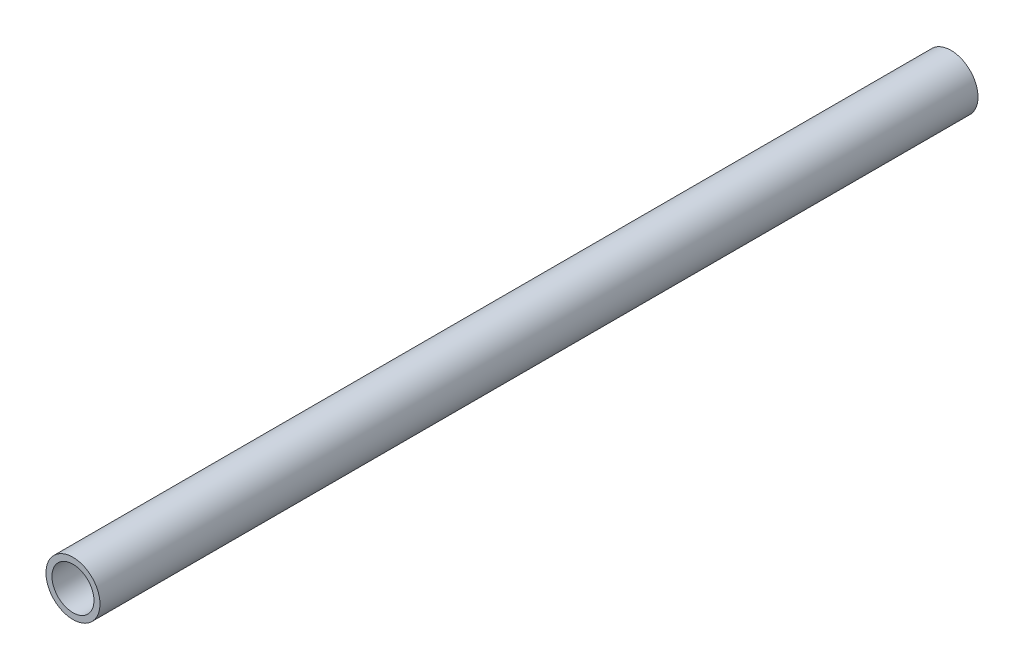
ISO-10303-21;
HEADER;
FILE_DESCRIPTION(('STEP AP214'),'2;1');
FILE_NAME('part.step','',(''),(''),'','','');
FILE_SCHEMA(('AUTOMOTIVE_DESIGN { 1 0 10303 214 1 1 1 1 }'));
ENDSEC;
DATA;
#1=APPLICATION_CONTEXT('core data for automotive mechanical design processes');
#2=APPLICATION_PROTOCOL_DEFINITION('international standard','automotive_design',2000,#1);
#3=PRODUCT_CONTEXT('',#1,'mechanical');
#4=PRODUCT('Part','Part','',(#3));
#5=PRODUCT_RELATED_PRODUCT_CATEGORY('part','',(#4));
#6=PRODUCT_DEFINITION_FORMATION('','',#4);
#7=PRODUCT_DEFINITION_CONTEXT('part definition',#1,'design');
#8=PRODUCT_DEFINITION('design','',#6,#7);
#9=PRODUCT_DEFINITION_SHAPE('','',#8);
#10=(LENGTH_UNIT() NAMED_UNIT(*) SI_UNIT(.MILLI.,.METRE.));
#11=(NAMED_UNIT(*) PLANE_ANGLE_UNIT() SI_UNIT($,.RADIAN.));
#12=(NAMED_UNIT(*) SI_UNIT($,.STERADIAN.) SOLID_ANGLE_UNIT());
#13=UNCERTAINTY_MEASURE_WITH_UNIT(LENGTH_MEASURE(1.E-05),#10,'distance_accuracy_value','');
#14=(GEOMETRIC_REPRESENTATION_CONTEXT(3) GLOBAL_UNCERTAINTY_ASSIGNED_CONTEXT((#13)) GLOBAL_UNIT_ASSIGNED_CONTEXT((#10,
#11,#12)) REPRESENTATION_CONTEXT('',''));
#15=CARTESIAN_POINT('',(0.,0.,0.));
#16=DIRECTION('',(0.,0.,1.));
#17=DIRECTION('',(1.,0.,0.));
#18=AXIS2_PLACEMENT_3D('',#15,#16,#17);
#19=CARTESIAN_POINT('',(0.,0.,292.66));
#20=DIRECTION('',(0.,0.,1.));
#21=DIRECTION('',(1.,0.,0.));
#22=AXIS2_PLACEMENT_3D('',#19,#20,#21);
#23=PLANE('',#22);
#24=CARTESIAN_POINT('',(0.,0.,292.66));
#25=DIRECTION('',(0.,0.,1.));
#26=DIRECTION('',(1.,0.,0.));
#27=AXIS2_PLACEMENT_3D('',#24,#25,#26);
#28=CIRCLE('',#27,9.);
#29=CARTESIAN_POINT('',(9.,0.,292.66));
#30=VERTEX_POINT('',#29);
#31=EDGE_CURVE('E10',#30,#30,#28,.T.);
#32=ORIENTED_EDGE('',*,*,#31,.T.);
#33=EDGE_LOOP('',(#32));
#34=FACE_BOUND('',#33,.T.);
#35=CARTESIAN_POINT('',(0.,0.,292.66));
#36=DIRECTION('',(0.,0.,1.));
#37=DIRECTION('',(1.,0.,0.));
#38=AXIS2_PLACEMENT_3D('',#35,#36,#37);
#39=CIRCLE('',#38,7.);
#40=CARTESIAN_POINT('',(7.,0.,292.66));
#41=VERTEX_POINT('',#40);
#42=EDGE_CURVE('E41',#41,#41,#39,.T.);
#43=ORIENTED_EDGE('',*,*,#42,.F.);
#44=EDGE_LOOP('',(#43));
#45=FACE_BOUND('',#44,.T.);
#46=ADVANCED_FACE('F30',(#34,#45),#23,.T.);
#47=CARTESIAN_POINT('',(0.,0.,0.));
#48=DIRECTION('',(0.,0.,1.));
#49=DIRECTION('',(1.,0.,0.));
#50=AXIS2_PLACEMENT_3D('',#47,#48,#49);
#51=PLANE('',#50);
#52=CARTESIAN_POINT('',(0.,0.,0.));
#53=DIRECTION('',(0.,0.,1.));
#54=DIRECTION('',(1.,0.,0.));
#55=AXIS2_PLACEMENT_3D('',#52,#53,#54);
#56=CIRCLE('',#55,9.);
#57=CARTESIAN_POINT('',(9.,0.,0.));
#58=VERTEX_POINT('',#57);
#59=EDGE_CURVE('E34',#58,#58,#56,.T.);
#60=ORIENTED_EDGE('',*,*,#59,.F.);
#61=EDGE_LOOP('',(#60));
#62=FACE_BOUND('',#61,.T.);
#63=CARTESIAN_POINT('',(0.,0.,0.));
#64=DIRECTION('',(0.,0.,1.));
#65=DIRECTION('',(1.,0.,0.));
#66=AXIS2_PLACEMENT_3D('',#63,#64,#65);
#67=CIRCLE('',#66,7.);
#68=CARTESIAN_POINT('',(7.,0.,0.));
#69=VERTEX_POINT('',#68);
#70=EDGE_CURVE('E43',#69,#69,#67,.T.);
#71=ORIENTED_EDGE('',*,*,#70,.T.);
#72=EDGE_LOOP('',(#71));
#73=FACE_BOUND('',#72,.T.);
#74=ADVANCED_FACE('F53',(#62,#73),#51,.F.);
#75=CARTESIAN_POINT('',(0.,0.,292.66));
#76=DIRECTION('',(0.,0.,-1.));
#77=DIRECTION('',(-1.,0.,0.));
#78=AXIS2_PLACEMENT_3D('',#75,#76,#77);
#79=CYLINDRICAL_SURFACE('',#78,9.);
#80=ORIENTED_EDGE('',*,*,#31,.F.);
#81=EDGE_LOOP('',(#80));
#82=FACE_BOUND('',#81,.T.);
#83=ORIENTED_EDGE('',*,*,#59,.T.);
#84=EDGE_LOOP('',(#83));
#85=FACE_BOUND('',#84,.T.);
#86=ADVANCED_FACE('F32',(#82,#85),#79,.T.);
#87=CARTESIAN_POINT('',(0.,0.,292.66));
#88=DIRECTION('',(0.,0.,-1.));
#89=DIRECTION('',(-1.,0.,0.));
#90=AXIS2_PLACEMENT_3D('',#87,#88,#89);
#91=CYLINDRICAL_SURFACE('',#90,7.);
#92=ORIENTED_EDGE('',*,*,#42,.T.);
#93=EDGE_LOOP('',(#92));
#94=FACE_BOUND('',#93,.T.);
#95=ORIENTED_EDGE('',*,*,#70,.F.);
#96=EDGE_LOOP('',(#95));
#97=FACE_BOUND('',#96,.T.);
#98=ADVANCED_FACE('F49',(#94,#97),#91,.F.);
#99=CLOSED_SHELL('',(#46,#74,#86,#98));
#100=MANIFOLD_SOLID_BREP('B2',#99);
#101=ADVANCED_BREP_SHAPE_REPRESENTATION('',(#18,#100),#14);
#102=SHAPE_DEFINITION_REPRESENTATION(#9,#101);
ENDSEC;
END-ISO-10303-21;
